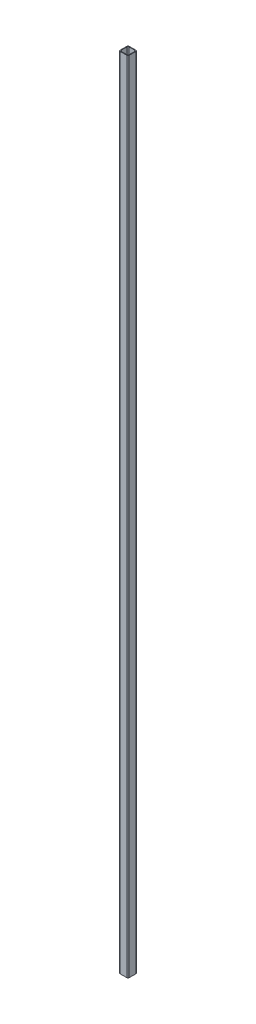
ISO-10303-21;
HEADER;
FILE_DESCRIPTION(('STEP AP214'),'2;1');
FILE_NAME('part.step','',(''),(''),'','','');
FILE_SCHEMA(('AUTOMOTIVE_DESIGN { 1 0 10303 214 1 1 1 1 }'));
ENDSEC;
DATA;
#1=APPLICATION_CONTEXT('core data for automotive mechanical design processes');
#2=APPLICATION_PROTOCOL_DEFINITION('international standard','automotive_design',2000,#1);
#3=PRODUCT_CONTEXT('',#1,'mechanical');
#4=PRODUCT('Part','Part','',(#3));
#5=PRODUCT_RELATED_PRODUCT_CATEGORY('part','',(#4));
#6=PRODUCT_DEFINITION_FORMATION('','',#4);
#7=PRODUCT_DEFINITION_CONTEXT('part definition',#1,'design');
#8=PRODUCT_DEFINITION('design','',#6,#7);
#9=PRODUCT_DEFINITION_SHAPE('','',#8);
#10=(LENGTH_UNIT() NAMED_UNIT(*) SI_UNIT(.MILLI.,.METRE.));
#11=(NAMED_UNIT(*) PLANE_ANGLE_UNIT() SI_UNIT($,.RADIAN.));
#12=(NAMED_UNIT(*) SI_UNIT($,.STERADIAN.) SOLID_ANGLE_UNIT());
#13=UNCERTAINTY_MEASURE_WITH_UNIT(LENGTH_MEASURE(1.E-05),#10,'distance_accuracy_value','');
#14=(GEOMETRIC_REPRESENTATION_CONTEXT(3) GLOBAL_UNCERTAINTY_ASSIGNED_CONTEXT((#13)) GLOBAL_UNIT_ASSIGNED_CONTEXT((#10,
#11,#12)) REPRESENTATION_CONTEXT('',''));
#15=CARTESIAN_POINT('',(0.,0.,0.));
#16=DIRECTION('',(0.,0.,1.));
#17=DIRECTION('',(1.,0.,0.));
#18=AXIS2_PLACEMENT_3D('',#15,#16,#17);
#19=CARTESIAN_POINT('',(-3.,715.,3.));
#20=DIRECTION('',(0.,-1.,0.));
#21=DIRECTION('',(0.,0.,-1.));
#22=AXIS2_PLACEMENT_3D('',#19,#20,#21);
#23=PLANE('',#22);
#24=CARTESIAN_POINT('',(-3.,715.,3.));
#25=DIRECTION('',(0.,1.,0.));
#26=DIRECTION('',(0.,0.,-1.));
#27=AXIS2_PLACEMENT_3D('',#24,#25,#26);
#28=CIRCLE('',#27,1.);
#29=CARTESIAN_POINT('',(-4.,715.,3.));
#30=VERTEX_POINT('',#29);
#31=CARTESIAN_POINT('',(-3.,715.,4.));
#32=VERTEX_POINT('',#31);
#33=EDGE_CURVE('E213',#30,#32,#28,.T.);
#34=ORIENTED_EDGE('',*,*,#33,.T.);
#35=DIRECTION('',(1.,0.,0.));
#36=VECTOR('',#35,1.);
#37=CARTESIAN_POINT('',(-3.,715.,4.));
#38=LINE('',#37,#36);
#39=CARTESIAN_POINT('',(3.,715.,4.));
#40=VERTEX_POINT('',#39);
#41=EDGE_CURVE('E216',#32,#40,#38,.T.);
#42=ORIENTED_EDGE('',*,*,#41,.T.);
#43=CARTESIAN_POINT('',(3.,715.,3.));
#44=DIRECTION('',(0.,1.,0.));
#45=DIRECTION('',(0.,0.,1.));
#46=AXIS2_PLACEMENT_3D('',#43,#44,#45);
#47=CIRCLE('',#46,1.);
#48=CARTESIAN_POINT('',(4.,715.,3.));
#49=VERTEX_POINT('',#48);
#50=EDGE_CURVE('E219',#40,#49,#47,.T.);
#51=ORIENTED_EDGE('',*,*,#50,.T.);
#52=DIRECTION('',(0.,0.,-1.));
#53=VECTOR('',#52,1.);
#54=CARTESIAN_POINT('',(4.,715.,3.));
#55=LINE('',#54,#53);
#56=CARTESIAN_POINT('',(4.,715.,-3.));
#57=VERTEX_POINT('',#56);
#58=EDGE_CURVE('E221',#49,#57,#55,.T.);
#59=ORIENTED_EDGE('',*,*,#58,.T.);
#60=CARTESIAN_POINT('',(3.,715.,-3.));
#61=DIRECTION('',(0.,1.,0.));
#62=DIRECTION('',(0.,0.,-1.));
#63=AXIS2_PLACEMENT_3D('',#60,#61,#62);
#64=CIRCLE('',#63,1.);
#65=CARTESIAN_POINT('',(3.,715.,-4.));
#66=VERTEX_POINT('',#65);
#67=EDGE_CURVE('E223',#57,#66,#64,.T.);
#68=ORIENTED_EDGE('',*,*,#67,.T.);
#69=DIRECTION('',(-1.,0.,0.));
#70=VECTOR('',#69,1.);
#71=CARTESIAN_POINT('',(-3.,715.,-4.));
#72=LINE('',#71,#70);
#73=CARTESIAN_POINT('',(-3.,715.,-4.));
#74=VERTEX_POINT('',#73);
#75=EDGE_CURVE('E225',#66,#74,#72,.T.);
#76=ORIENTED_EDGE('',*,*,#75,.T.);
#77=CARTESIAN_POINT('',(-3.,715.,-3.));
#78=DIRECTION('',(0.,1.,0.));
#79=DIRECTION('',(0.,0.,-1.));
#80=AXIS2_PLACEMENT_3D('',#77,#78,#79);
#81=CIRCLE('',#80,1.);
#82=CARTESIAN_POINT('',(-4.,715.,-3.));
#83=VERTEX_POINT('',#82);
#84=EDGE_CURVE('E227',#74,#83,#81,.T.);
#85=ORIENTED_EDGE('',*,*,#84,.T.);
#86=DIRECTION('',(0.,0.,1.));
#87=VECTOR('',#86,1.);
#88=CARTESIAN_POINT('',(-4.,715.,3.));
#89=LINE('',#88,#87);
#90=EDGE_CURVE('E229',#83,#30,#89,.T.);
#91=ORIENTED_EDGE('',*,*,#90,.T.);
#92=EDGE_LOOP('',(#34,#42,#51,#59,#68,#76,#85,#91));
#93=FACE_BOUND('',#92,.T.);
#94=CARTESIAN_POINT('',(-2.5,715.,2.5));
#95=DIRECTION('',(0.,1.,0.));
#96=DIRECTION('',(0.,0.,-1.));
#97=AXIS2_PLACEMENT_3D('',#94,#95,#96);
#98=CIRCLE('',#97,1.);
#99=CARTESIAN_POINT('',(-3.5,715.,2.5));
#100=VERTEX_POINT('',#99);
#101=CARTESIAN_POINT('',(-2.5,715.,3.5));
#102=VERTEX_POINT('',#101);
#103=EDGE_CURVE('E148',#100,#102,#98,.T.);
#104=ORIENTED_EDGE('',*,*,#103,.F.);
#105=DIRECTION('',(0.,0.,1.));
#106=VECTOR('',#105,1.);
#107=CARTESIAN_POINT('',(-3.5,715.,2.5));
#108=LINE('',#107,#106);
#109=CARTESIAN_POINT('',(-3.5,715.,-2.5));
#110=VERTEX_POINT('',#109);
#111=EDGE_CURVE('E181',#110,#100,#108,.T.);
#112=ORIENTED_EDGE('',*,*,#111,.F.);
#113=CARTESIAN_POINT('',(-2.5,715.,-2.5));
#114=DIRECTION('',(0.,1.,0.));
#115=DIRECTION('',(0.,0.,-1.));
#116=AXIS2_PLACEMENT_3D('',#113,#114,#115);
#117=CIRCLE('',#116,1.);
#118=CARTESIAN_POINT('',(-2.5,715.,-3.5));
#119=VERTEX_POINT('',#118);
#120=EDGE_CURVE('E179',#119,#110,#117,.T.);
#121=ORIENTED_EDGE('',*,*,#120,.F.);
#122=DIRECTION('',(-1.,0.,0.));
#123=VECTOR('',#122,1.);
#124=CARTESIAN_POINT('',(-2.5,715.,-3.5));
#125=LINE('',#124,#123);
#126=CARTESIAN_POINT('',(2.5,715.,-3.5));
#127=VERTEX_POINT('',#126);
#128=EDGE_CURVE('E177',#127,#119,#125,.T.);
#129=ORIENTED_EDGE('',*,*,#128,.F.);
#130=CARTESIAN_POINT('',(2.5,715.,-2.5));
#131=DIRECTION('',(0.,1.,0.));
#132=DIRECTION('',(0.,0.,-1.));
#133=AXIS2_PLACEMENT_3D('',#130,#131,#132);
#134=CIRCLE('',#133,1.);
#135=CARTESIAN_POINT('',(3.5,715.,-2.5));
#136=VERTEX_POINT('',#135);
#137=EDGE_CURVE('E175',#136,#127,#134,.T.);
#138=ORIENTED_EDGE('',*,*,#137,.F.);
#139=DIRECTION('',(0.,0.,-1.));
#140=VECTOR('',#139,1.);
#141=CARTESIAN_POINT('',(3.5,715.,2.5));
#142=LINE('',#141,#140);
#143=CARTESIAN_POINT('',(3.5,715.,2.5));
#144=VERTEX_POINT('',#143);
#145=EDGE_CURVE('E171',#144,#136,#142,.T.);
#146=ORIENTED_EDGE('',*,*,#145,.F.);
#147=CARTESIAN_POINT('',(2.5,715.,2.5));
#148=DIRECTION('',(0.,1.,0.));
#149=DIRECTION('',(0.,0.,1.));
#150=AXIS2_PLACEMENT_3D('',#147,#148,#149);
#151=CIRCLE('',#150,1.);
#152=CARTESIAN_POINT('',(2.5,715.,3.5));
#153=VERTEX_POINT('',#152);
#154=EDGE_CURVE('E169',#153,#144,#151,.T.);
#155=ORIENTED_EDGE('',*,*,#154,.F.);
#156=DIRECTION('',(1.,0.,0.));
#157=VECTOR('',#156,1.);
#158=CARTESIAN_POINT('',(-2.5,715.,3.5));
#159=LINE('',#158,#157);
#160=EDGE_CURVE('E156',#102,#153,#159,.T.);
#161=ORIENTED_EDGE('',*,*,#160,.F.);
#162=EDGE_LOOP('',(#104,#112,#121,#129,#138,#146,#155,#161));
#163=FACE_BOUND('',#162,.T.);
#164=ADVANCED_FACE('F35',(#93,#163),#23,.F.);
#165=CARTESIAN_POINT('',(-3.,0.,3.));
#166=DIRECTION('',(0.,-1.,0.));
#167=DIRECTION('',(0.,0.,-1.));
#168=AXIS2_PLACEMENT_3D('',#165,#166,#167);
#169=PLANE('',#168);
#170=CARTESIAN_POINT('',(-3.,0.,3.));
#171=DIRECTION('',(0.,1.,0.));
#172=DIRECTION('',(0.,0.,-1.));
#173=AXIS2_PLACEMENT_3D('',#170,#171,#172);
#174=CIRCLE('',#173,1.);
#175=CARTESIAN_POINT('',(-4.,0.,3.));
#176=VERTEX_POINT('',#175);
#177=CARTESIAN_POINT('',(-3.,0.,4.));
#178=VERTEX_POINT('',#177);
#179=EDGE_CURVE('E164',#176,#178,#174,.T.);
#180=ORIENTED_EDGE('',*,*,#179,.F.);
#181=DIRECTION('',(0.,0.,1.));
#182=VECTOR('',#181,1.);
#183=CARTESIAN_POINT('',(-4.,0.,3.));
#184=LINE('',#183,#182);
#185=CARTESIAN_POINT('',(-4.,0.,-3.));
#186=VERTEX_POINT('',#185);
#187=EDGE_CURVE('E217',#186,#176,#184,.T.);
#188=ORIENTED_EDGE('',*,*,#187,.F.);
#189=CARTESIAN_POINT('',(-3.,0.,-3.));
#190=DIRECTION('',(0.,1.,0.));
#191=DIRECTION('',(0.,0.,-1.));
#192=AXIS2_PLACEMENT_3D('',#189,#190,#191);
#193=CIRCLE('',#192,1.);
#194=CARTESIAN_POINT('',(-3.,0.,-4.));
#195=VERTEX_POINT('',#194);
#196=EDGE_CURVE('E244',#195,#186,#193,.T.);
#197=ORIENTED_EDGE('',*,*,#196,.F.);
#198=DIRECTION('',(-1.,0.,0.));
#199=VECTOR('',#198,1.);
#200=CARTESIAN_POINT('',(-3.,0.,-4.));
#201=LINE('',#200,#199);
#202=CARTESIAN_POINT('',(3.,0.,-4.));
#203=VERTEX_POINT('',#202);
#204=EDGE_CURVE('E242',#203,#195,#201,.T.);
#205=ORIENTED_EDGE('',*,*,#204,.F.);
#206=CARTESIAN_POINT('',(3.,0.,-3.));
#207=DIRECTION('',(0.,1.,0.));
#208=DIRECTION('',(0.,0.,-1.));
#209=AXIS2_PLACEMENT_3D('',#206,#207,#208);
#210=CIRCLE('',#209,1.);
#211=CARTESIAN_POINT('',(4.,0.,-3.));
#212=VERTEX_POINT('',#211);
#213=EDGE_CURVE('E240',#212,#203,#210,.T.);
#214=ORIENTED_EDGE('',*,*,#213,.F.);
#215=DIRECTION('',(0.,0.,-1.));
#216=VECTOR('',#215,1.);
#217=CARTESIAN_POINT('',(4.,0.,3.));
#218=LINE('',#217,#216);
#219=CARTESIAN_POINT('',(4.,0.,3.));
#220=VERTEX_POINT('',#219);
#221=EDGE_CURVE('E238',#220,#212,#218,.T.);
#222=ORIENTED_EDGE('',*,*,#221,.F.);
#223=CARTESIAN_POINT('',(3.,0.,3.));
#224=DIRECTION('',(0.,1.,0.));
#225=DIRECTION('',(0.,0.,1.));
#226=AXIS2_PLACEMENT_3D('',#223,#224,#225);
#227=CIRCLE('',#226,1.);
#228=CARTESIAN_POINT('',(3.,0.,4.));
#229=VERTEX_POINT('',#228);
#230=EDGE_CURVE('E236',#229,#220,#227,.T.);
#231=ORIENTED_EDGE('',*,*,#230,.F.);
#232=DIRECTION('',(1.,0.,0.));
#233=VECTOR('',#232,1.);
#234=CARTESIAN_POINT('',(-3.,0.,4.));
#235=LINE('',#234,#233);
#236=EDGE_CURVE('E234',#178,#229,#235,.T.);
#237=ORIENTED_EDGE('',*,*,#236,.F.);
#238=EDGE_LOOP('',(#180,#188,#197,#205,#214,#222,#231,#237));
#239=FACE_BOUND('',#238,.T.);
#240=DIRECTION('',(0.,0.,1.));
#241=VECTOR('',#240,1.);
#242=CARTESIAN_POINT('',(-3.5,0.,2.5));
#243=LINE('',#242,#241);
#244=CARTESIAN_POINT('',(-3.5,0.,-2.5));
#245=VERTEX_POINT('',#244);
#246=CARTESIAN_POINT('',(-3.5,0.,2.5));
#247=VERTEX_POINT('',#246);
#248=EDGE_CURVE('E157',#245,#247,#243,.T.);
#249=ORIENTED_EDGE('',*,*,#248,.T.);
#250=CARTESIAN_POINT('',(-2.5,0.,2.5));
#251=DIRECTION('',(0.,1.,0.));
#252=DIRECTION('',(0.,0.,-1.));
#253=AXIS2_PLACEMENT_3D('',#250,#251,#252);
#254=CIRCLE('',#253,1.);
#255=CARTESIAN_POINT('',(-2.5,0.,3.5));
#256=VERTEX_POINT('',#255);
#257=EDGE_CURVE('E58',#247,#256,#254,.T.);
#258=ORIENTED_EDGE('',*,*,#257,.T.);
#259=DIRECTION('',(1.,0.,0.));
#260=VECTOR('',#259,1.);
#261=CARTESIAN_POINT('',(-2.5,0.,3.5));
#262=LINE('',#261,#260);
#263=CARTESIAN_POINT('',(2.5,0.,3.5));
#264=VERTEX_POINT('',#263);
#265=EDGE_CURVE('E163',#256,#264,#262,.T.);
#266=ORIENTED_EDGE('',*,*,#265,.T.);
#267=CARTESIAN_POINT('',(2.5,0.,2.5));
#268=DIRECTION('',(0.,1.,0.));
#269=DIRECTION('',(0.,0.,1.));
#270=AXIS2_PLACEMENT_3D('',#267,#268,#269);
#271=CIRCLE('',#270,1.);
#272=CARTESIAN_POINT('',(3.5,0.,2.5));
#273=VERTEX_POINT('',#272);
#274=EDGE_CURVE('E185',#264,#273,#271,.T.);
#275=ORIENTED_EDGE('',*,*,#274,.T.);
#276=DIRECTION('',(0.,0.,-1.));
#277=VECTOR('',#276,1.);
#278=CARTESIAN_POINT('',(3.5,0.,2.5));
#279=LINE('',#278,#277);
#280=CARTESIAN_POINT('',(3.5,0.,-2.5));
#281=VERTEX_POINT('',#280);
#282=EDGE_CURVE('E188',#273,#281,#279,.T.);
#283=ORIENTED_EDGE('',*,*,#282,.T.);
#284=CARTESIAN_POINT('',(2.5,0.,-2.5));
#285=DIRECTION('',(0.,1.,0.));
#286=DIRECTION('',(0.,0.,-1.));
#287=AXIS2_PLACEMENT_3D('',#284,#285,#286);
#288=CIRCLE('',#287,1.);
#289=CARTESIAN_POINT('',(2.5,0.,-3.5));
#290=VERTEX_POINT('',#289);
#291=EDGE_CURVE('E191',#281,#290,#288,.T.);
#292=ORIENTED_EDGE('',*,*,#291,.T.);
#293=DIRECTION('',(-1.,0.,0.));
#294=VECTOR('',#293,1.);
#295=CARTESIAN_POINT('',(-2.5,0.,-3.5));
#296=LINE('',#295,#294);
#297=CARTESIAN_POINT('',(-2.5,0.,-3.5));
#298=VERTEX_POINT('',#297);
#299=EDGE_CURVE('E194',#290,#298,#296,.T.);
#300=ORIENTED_EDGE('',*,*,#299,.T.);
#301=CARTESIAN_POINT('',(-2.5,0.,-2.5));
#302=DIRECTION('',(0.,1.,0.));
#303=DIRECTION('',(0.,0.,-1.));
#304=AXIS2_PLACEMENT_3D('',#301,#302,#303);
#305=CIRCLE('',#304,1.);
#306=EDGE_CURVE('E197',#298,#245,#305,.T.);
#307=ORIENTED_EDGE('',*,*,#306,.T.);
#308=EDGE_LOOP('',(#249,#258,#266,#275,#283,#292,#300,#307));
#309=FACE_BOUND('',#308,.T.);
#310=ADVANCED_FACE('F274',(#239,#309),#169,.T.);
#311=CARTESIAN_POINT('',(-3.,715.,3.));
#312=DIRECTION('',(0.,-1.,0.));
#313=DIRECTION('',(0.,0.,-1.));
#314=AXIS2_PLACEMENT_3D('',#311,#312,#313);
#315=CYLINDRICAL_SURFACE('',#314,1.);
#316=ORIENTED_EDGE('',*,*,#179,.T.);
#317=DIRECTION('',(0.,-1.,0.));
#318=VECTOR('',#317,1.);
#319=CARTESIAN_POINT('',(-3.,715.,4.));
#320=LINE('',#319,#318);
#321=EDGE_CURVE('E11',#32,#178,#320,.T.);
#322=ORIENTED_EDGE('',*,*,#321,.F.);
#323=ORIENTED_EDGE('',*,*,#33,.F.);
#324=DIRECTION('',(0.,-1.,0.));
#325=VECTOR('',#324,1.);
#326=CARTESIAN_POINT('',(-4.,715.,3.));
#327=LINE('',#326,#325);
#328=EDGE_CURVE('E231',#30,#176,#327,.T.);
#329=ORIENTED_EDGE('',*,*,#328,.T.);
#330=EDGE_LOOP('',(#316,#322,#323,#329));
#331=FACE_BOUND('',#330,.T.);
#332=ADVANCED_FACE('F37',(#331),#315,.T.);
#333=CARTESIAN_POINT('',(-3.,715.,4.));
#334=DIRECTION('',(0.,0.,-1.));
#335=DIRECTION('',(-1.,0.,0.));
#336=AXIS2_PLACEMENT_3D('',#333,#334,#335);
#337=PLANE('',#336);
#338=ORIENTED_EDGE('',*,*,#236,.T.);
#339=DIRECTION('',(0.,-1.,0.));
#340=VECTOR('',#339,1.);
#341=CARTESIAN_POINT('',(3.,715.,4.));
#342=LINE('',#341,#340);
#343=EDGE_CURVE('E43',#40,#229,#342,.T.);
#344=ORIENTED_EDGE('',*,*,#343,.F.);
#345=ORIENTED_EDGE('',*,*,#41,.F.);
#346=ORIENTED_EDGE('',*,*,#321,.T.);
#347=EDGE_LOOP('',(#338,#344,#345,#346));
#348=FACE_BOUND('',#347,.T.);
#349=ADVANCED_FACE('F291',(#348),#337,.F.);
#350=CARTESIAN_POINT('',(3.,715.,3.));
#351=DIRECTION('',(0.,-1.,0.));
#352=DIRECTION('',(0.,0.,-1.));
#353=AXIS2_PLACEMENT_3D('',#350,#351,#352);
#354=CYLINDRICAL_SURFACE('',#353,1.);
#355=ORIENTED_EDGE('',*,*,#230,.T.);
#356=DIRECTION('',(0.,-1.,0.));
#357=VECTOR('',#356,1.);
#358=CARTESIAN_POINT('',(4.,715.,3.));
#359=LINE('',#358,#357);
#360=EDGE_CURVE('E261',#49,#220,#359,.T.);
#361=ORIENTED_EDGE('',*,*,#360,.F.);
#362=ORIENTED_EDGE('',*,*,#50,.F.);
#363=ORIENTED_EDGE('',*,*,#343,.T.);
#364=EDGE_LOOP('',(#355,#361,#362,#363));
#365=FACE_BOUND('',#364,.T.);
#366=ADVANCED_FACE('F268',(#365),#354,.T.);
#367=CARTESIAN_POINT('',(4.,715.,3.));
#368=DIRECTION('',(-1.,0.,0.));
#369=DIRECTION('',(0.,0.,1.));
#370=AXIS2_PLACEMENT_3D('',#367,#368,#369);
#371=PLANE('',#370);
#372=ORIENTED_EDGE('',*,*,#221,.T.);
#373=DIRECTION('',(0.,-1.,0.));
#374=VECTOR('',#373,1.);
#375=CARTESIAN_POINT('',(4.,715.,-3.));
#376=LINE('',#375,#374);
#377=EDGE_CURVE('E258',#57,#212,#376,.T.);
#378=ORIENTED_EDGE('',*,*,#377,.F.);
#379=ORIENTED_EDGE('',*,*,#58,.F.);
#380=ORIENTED_EDGE('',*,*,#360,.T.);
#381=EDGE_LOOP('',(#372,#378,#379,#380));
#382=FACE_BOUND('',#381,.T.);
#383=ADVANCED_FACE('F280',(#382),#371,.F.);
#384=CARTESIAN_POINT('',(3.,715.,-3.));
#385=DIRECTION('',(0.,-1.,0.));
#386=DIRECTION('',(0.,0.,-1.));
#387=AXIS2_PLACEMENT_3D('',#384,#385,#386);
#388=CYLINDRICAL_SURFACE('',#387,1.);
#389=ORIENTED_EDGE('',*,*,#213,.T.);
#390=DIRECTION('',(0.,-1.,0.));
#391=VECTOR('',#390,1.);
#392=CARTESIAN_POINT('',(3.,715.,-4.));
#393=LINE('',#392,#391);
#394=EDGE_CURVE('E255',#66,#203,#393,.T.);
#395=ORIENTED_EDGE('',*,*,#394,.F.);
#396=ORIENTED_EDGE('',*,*,#67,.F.);
#397=ORIENTED_EDGE('',*,*,#377,.T.);
#398=EDGE_LOOP('',(#389,#395,#396,#397));
#399=FACE_BOUND('',#398,.T.);
#400=ADVANCED_FACE('F284',(#399),#388,.T.);
#401=CARTESIAN_POINT('',(-3.,715.,-4.));
#402=DIRECTION('',(0.,0.,1.));
#403=DIRECTION('',(1.,0.,0.));
#404=AXIS2_PLACEMENT_3D('',#401,#402,#403);
#405=PLANE('',#404);
#406=ORIENTED_EDGE('',*,*,#204,.T.);
#407=DIRECTION('',(0.,-1.,0.));
#408=VECTOR('',#407,1.);
#409=CARTESIAN_POINT('',(-3.,715.,-4.));
#410=LINE('',#409,#408);
#411=EDGE_CURVE('E252',#74,#195,#410,.T.);
#412=ORIENTED_EDGE('',*,*,#411,.F.);
#413=ORIENTED_EDGE('',*,*,#75,.F.);
#414=ORIENTED_EDGE('',*,*,#394,.T.);
#415=EDGE_LOOP('',(#406,#412,#413,#414));
#416=FACE_BOUND('',#415,.T.);
#417=ADVANCED_FACE('F304',(#416),#405,.F.);
#418=CARTESIAN_POINT('',(-3.,715.,-3.));
#419=DIRECTION('',(0.,-1.,0.));
#420=DIRECTION('',(0.,0.,-1.));
#421=AXIS2_PLACEMENT_3D('',#418,#419,#420);
#422=CYLINDRICAL_SURFACE('',#421,1.);
#423=ORIENTED_EDGE('',*,*,#196,.T.);
#424=DIRECTION('',(0.,-1.,0.));
#425=VECTOR('',#424,1.);
#426=CARTESIAN_POINT('',(-4.,715.,-3.));
#427=LINE('',#426,#425);
#428=EDGE_CURVE('E249',#83,#186,#427,.T.);
#429=ORIENTED_EDGE('',*,*,#428,.F.);
#430=ORIENTED_EDGE('',*,*,#84,.F.);
#431=ORIENTED_EDGE('',*,*,#411,.T.);
#432=EDGE_LOOP('',(#423,#429,#430,#431));
#433=FACE_BOUND('',#432,.T.);
#434=ADVANCED_FACE('F302',(#433),#422,.T.);
#435=CARTESIAN_POINT('',(-4.,715.,3.));
#436=DIRECTION('',(1.,0.,0.));
#437=DIRECTION('',(0.,0.,-1.));
#438=AXIS2_PLACEMENT_3D('',#435,#436,#437);
#439=PLANE('',#438);
#440=ORIENTED_EDGE('',*,*,#187,.T.);
#441=ORIENTED_EDGE('',*,*,#328,.F.);
#442=ORIENTED_EDGE('',*,*,#90,.F.);
#443=ORIENTED_EDGE('',*,*,#428,.T.);
#444=EDGE_LOOP('',(#440,#441,#442,#443));
#445=FACE_BOUND('',#444,.T.);
#446=ADVANCED_FACE('F297',(#445),#439,.F.);
#447=CARTESIAN_POINT('',(-2.5,715.,2.5));
#448=DIRECTION('',(0.,-1.,0.));
#449=DIRECTION('',(0.,0.,-1.));
#450=AXIS2_PLACEMENT_3D('',#447,#448,#449);
#451=CYLINDRICAL_SURFACE('',#450,1.);
#452=ORIENTED_EDGE('',*,*,#257,.F.);
#453=DIRECTION('',(0.,-1.,0.));
#454=VECTOR('',#453,1.);
#455=CARTESIAN_POINT('',(-3.5,715.,2.5));
#456=LINE('',#455,#454);
#457=EDGE_CURVE('E152',#100,#247,#456,.T.);
#458=ORIENTED_EDGE('',*,*,#457,.F.);
#459=ORIENTED_EDGE('',*,*,#103,.T.);
#460=DIRECTION('',(0.,-1.,0.));
#461=VECTOR('',#460,1.);
#462=CARTESIAN_POINT('',(-2.5,715.,3.5));
#463=LINE('',#462,#461);
#464=EDGE_CURVE('E151',#102,#256,#463,.T.);
#465=ORIENTED_EDGE('',*,*,#464,.T.);
#466=EDGE_LOOP('',(#452,#458,#459,#465));
#467=FACE_BOUND('',#466,.T.);
#468=ADVANCED_FACE('F150',(#467),#451,.F.);
#469=CARTESIAN_POINT('',(-2.5,715.,3.5));
#470=DIRECTION('',(0.,0.,-1.));
#471=DIRECTION('',(-1.,0.,0.));
#472=AXIS2_PLACEMENT_3D('',#469,#470,#471);
#473=PLANE('',#472);
#474=ORIENTED_EDGE('',*,*,#265,.F.);
#475=ORIENTED_EDGE('',*,*,#464,.F.);
#476=ORIENTED_EDGE('',*,*,#160,.T.);
#477=DIRECTION('',(0.,-1.,0.));
#478=VECTOR('',#477,1.);
#479=CARTESIAN_POINT('',(2.5,715.,3.5));
#480=LINE('',#479,#478);
#481=EDGE_CURVE('E165',#153,#264,#480,.T.);
#482=ORIENTED_EDGE('',*,*,#481,.T.);
#483=EDGE_LOOP('',(#474,#475,#476,#482));
#484=FACE_BOUND('',#483,.T.);
#485=ADVANCED_FACE('F160',(#484),#473,.T.);
#486=CARTESIAN_POINT('',(2.5,715.,2.5));
#487=DIRECTION('',(0.,-1.,0.));
#488=DIRECTION('',(0.,0.,-1.));
#489=AXIS2_PLACEMENT_3D('',#486,#487,#488);
#490=CYLINDRICAL_SURFACE('',#489,1.);
#491=ORIENTED_EDGE('',*,*,#274,.F.);
#492=ORIENTED_EDGE('',*,*,#481,.F.);
#493=ORIENTED_EDGE('',*,*,#154,.T.);
#494=DIRECTION('',(0.,-1.,0.));
#495=VECTOR('',#494,1.);
#496=CARTESIAN_POINT('',(3.5,715.,2.5));
#497=LINE('',#496,#495);
#498=EDGE_CURVE('E210',#144,#273,#497,.T.);
#499=ORIENTED_EDGE('',*,*,#498,.T.);
#500=EDGE_LOOP('',(#491,#492,#493,#499));
#501=FACE_BOUND('',#500,.T.);
#502=ADVANCED_FACE('F329',(#501),#490,.F.);
#503=CARTESIAN_POINT('',(3.5,715.,2.5));
#504=DIRECTION('',(-1.,0.,0.));
#505=DIRECTION('',(0.,0.,1.));
#506=AXIS2_PLACEMENT_3D('',#503,#504,#505);
#507=PLANE('',#506);
#508=ORIENTED_EDGE('',*,*,#282,.F.);
#509=ORIENTED_EDGE('',*,*,#498,.F.);
#510=ORIENTED_EDGE('',*,*,#145,.T.);
#511=DIRECTION('',(0.,-1.,0.));
#512=VECTOR('',#511,1.);
#513=CARTESIAN_POINT('',(3.5,715.,-2.5));
#514=LINE('',#513,#512);
#515=EDGE_CURVE('E208',#136,#281,#514,.T.);
#516=ORIENTED_EDGE('',*,*,#515,.T.);
#517=EDGE_LOOP('',(#508,#509,#510,#516));
#518=FACE_BOUND('',#517,.T.);
#519=ADVANCED_FACE('F333',(#518),#507,.T.);
#520=CARTESIAN_POINT('',(2.5,715.,-2.5));
#521=DIRECTION('',(0.,-1.,0.));
#522=DIRECTION('',(0.,0.,-1.));
#523=AXIS2_PLACEMENT_3D('',#520,#521,#522);
#524=CYLINDRICAL_SURFACE('',#523,1.);
#525=ORIENTED_EDGE('',*,*,#291,.F.);
#526=ORIENTED_EDGE('',*,*,#515,.F.);
#527=ORIENTED_EDGE('',*,*,#137,.T.);
#528=DIRECTION('',(0.,-1.,0.));
#529=VECTOR('',#528,1.);
#530=CARTESIAN_POINT('',(2.5,715.,-3.5));
#531=LINE('',#530,#529);
#532=EDGE_CURVE('E206',#127,#290,#531,.T.);
#533=ORIENTED_EDGE('',*,*,#532,.T.);
#534=EDGE_LOOP('',(#525,#526,#527,#533));
#535=FACE_BOUND('',#534,.T.);
#536=ADVANCED_FACE('F339',(#535),#524,.F.);
#537=CARTESIAN_POINT('',(-2.5,715.,-3.5));
#538=DIRECTION('',(0.,0.,1.));
#539=DIRECTION('',(1.,0.,0.));
#540=AXIS2_PLACEMENT_3D('',#537,#538,#539);
#541=PLANE('',#540);
#542=ORIENTED_EDGE('',*,*,#299,.F.);
#543=ORIENTED_EDGE('',*,*,#532,.F.);
#544=ORIENTED_EDGE('',*,*,#128,.T.);
#545=DIRECTION('',(0.,-1.,0.));
#546=VECTOR('',#545,1.);
#547=CARTESIAN_POINT('',(-2.5,715.,-3.5));
#548=LINE('',#547,#546);
#549=EDGE_CURVE('E204',#119,#298,#548,.T.);
#550=ORIENTED_EDGE('',*,*,#549,.T.);
#551=EDGE_LOOP('',(#542,#543,#544,#550));
#552=FACE_BOUND('',#551,.T.);
#553=ADVANCED_FACE('F343',(#552),#541,.T.);
#554=CARTESIAN_POINT('',(-2.5,715.,-2.5));
#555=DIRECTION('',(0.,-1.,0.));
#556=DIRECTION('',(0.,0.,-1.));
#557=AXIS2_PLACEMENT_3D('',#554,#555,#556);
#558=CYLINDRICAL_SURFACE('',#557,1.);
#559=ORIENTED_EDGE('',*,*,#306,.F.);
#560=ORIENTED_EDGE('',*,*,#549,.F.);
#561=ORIENTED_EDGE('',*,*,#120,.T.);
#562=DIRECTION('',(0.,-1.,0.));
#563=VECTOR('',#562,1.);
#564=CARTESIAN_POINT('',(-3.5,715.,-2.5));
#565=LINE('',#564,#563);
#566=EDGE_CURVE('E50',#110,#245,#565,.T.);
#567=ORIENTED_EDGE('',*,*,#566,.T.);
#568=EDGE_LOOP('',(#559,#560,#561,#567));
#569=FACE_BOUND('',#568,.T.);
#570=ADVANCED_FACE('F347',(#569),#558,.F.);
#571=CARTESIAN_POINT('',(-3.5,715.,2.5));
#572=DIRECTION('',(1.,0.,0.));
#573=DIRECTION('',(0.,0.,-1.));
#574=AXIS2_PLACEMENT_3D('',#571,#572,#573);
#575=PLANE('',#574);
#576=ORIENTED_EDGE('',*,*,#248,.F.);
#577=ORIENTED_EDGE('',*,*,#566,.F.);
#578=ORIENTED_EDGE('',*,*,#111,.T.);
#579=ORIENTED_EDGE('',*,*,#457,.T.);
#580=EDGE_LOOP('',(#576,#577,#578,#579));
#581=FACE_BOUND('',#580,.T.);
#582=ADVANCED_FACE('F351',(#581),#575,.T.);
#583=CLOSED_SHELL('',(#164,#310,#332,#349,#366,#383,#400,#417,#434,#446,#468,#485,#502,#519,
#536,#553,#570,#582));
#584=MANIFOLD_SOLID_BREP('B2',#583);
#585=ADVANCED_BREP_SHAPE_REPRESENTATION('',(#18,#584),#14);
#586=SHAPE_DEFINITION_REPRESENTATION(#9,#585);
ENDSEC;
END-ISO-10303-21;
